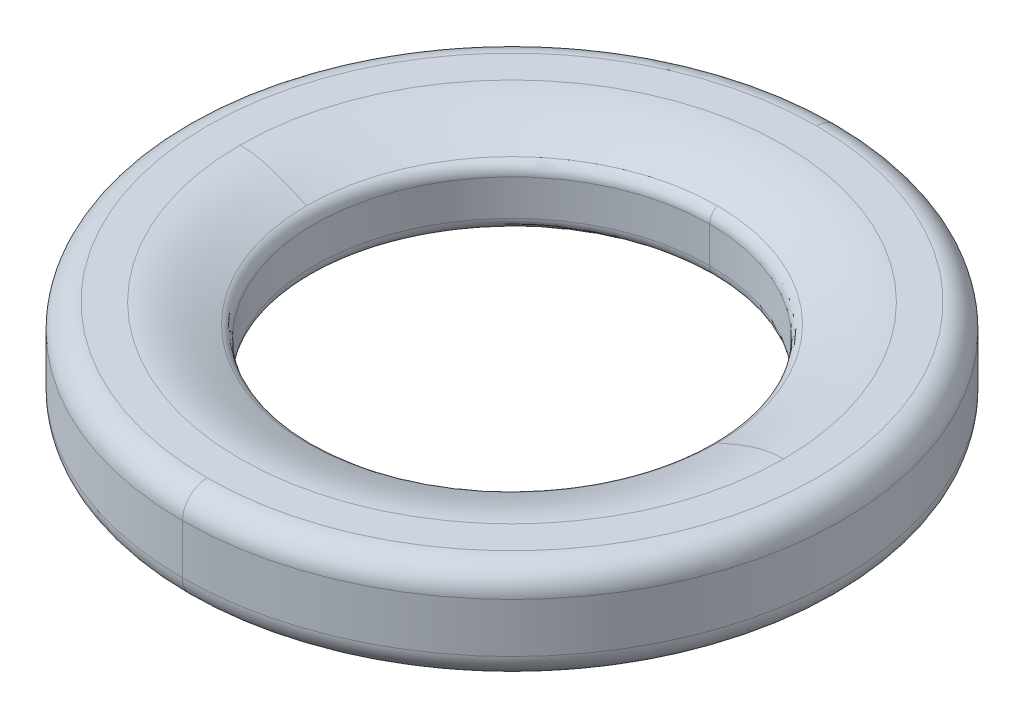
ISO-10303-21;
HEADER;
FILE_DESCRIPTION(('STEP AP214'),'2;1');
FILE_NAME('part.step','',(''),(''),'','','');
FILE_SCHEMA(('AUTOMOTIVE_DESIGN { 1 0 10303 214 1 1 1 1 }'));
ENDSEC;
DATA;
#1=APPLICATION_CONTEXT('core data for automotive mechanical design processes');
#2=APPLICATION_PROTOCOL_DEFINITION('international standard','automotive_design',2000,#1);
#3=PRODUCT_CONTEXT('',#1,'mechanical');
#4=PRODUCT('Part','Part','',(#3));
#5=PRODUCT_RELATED_PRODUCT_CATEGORY('part','',(#4));
#6=PRODUCT_DEFINITION_FORMATION('','',#4);
#7=PRODUCT_DEFINITION_CONTEXT('part definition',#1,'design');
#8=PRODUCT_DEFINITION('design','',#6,#7);
#9=PRODUCT_DEFINITION_SHAPE('','',#8);
#10=(LENGTH_UNIT() NAMED_UNIT(*) SI_UNIT(.MILLI.,.METRE.));
#11=(NAMED_UNIT(*) PLANE_ANGLE_UNIT() SI_UNIT($,.RADIAN.));
#12=(NAMED_UNIT(*) SI_UNIT($,.STERADIAN.) SOLID_ANGLE_UNIT());
#13=UNCERTAINTY_MEASURE_WITH_UNIT(LENGTH_MEASURE(1.E-05),#10,'distance_accuracy_value','');
#14=(GEOMETRIC_REPRESENTATION_CONTEXT(3) GLOBAL_UNCERTAINTY_ASSIGNED_CONTEXT((#13)) GLOBAL_UNIT_ASSIGNED_CONTEXT((#10,
#11,#12)) REPRESENTATION_CONTEXT('',''));
#15=CARTESIAN_POINT('',(0.,0.,0.));
#16=DIRECTION('',(0.,0.,1.));
#17=DIRECTION('',(1.,0.,0.));
#18=AXIS2_PLACEMENT_3D('',#15,#16,#17);
#19=CARTESIAN_POINT('',(-52.3875,9.525,0.));
#20=CARTESIAN_POINT('',(-52.3875,9.52499999999999,104.775));
#21=CARTESIAN_POINT('',(52.3875,9.52499999999999,104.775));
#22=CARTESIAN_POINT('',(52.3875,9.525,0.));
#23=CARTESIAN_POINT('',(-48.128802392508,9.525,0.));
#24=CARTESIAN_POINT('',(-48.128802392508,9.52499999999999,96.2576047850158));
#25=CARTESIAN_POINT('',(48.128802392508,9.52499999999999,96.2576047850158));
#26=CARTESIAN_POINT('',(48.128802392508,9.525,0.));
#27=CARTESIAN_POINT('',(-44.0392353785316,7.77764283602133,0.));
#28=CARTESIAN_POINT('',(-44.0392353785315,7.77764283602133,88.078470757063));
#29=CARTESIAN_POINT('',(44.0392353785315,7.77764283602133,88.078470757063));
#30=CARTESIAN_POINT('',(44.0392353785316,7.77764283602133,0.));
#31=CARTESIAN_POINT('',(-39.597960284823,5.77972972030741,0.));
#32=CARTESIAN_POINT('',(-39.597960284823,5.77972972030741,79.195920569646));
#33=CARTESIAN_POINT('',(39.597960284823,5.77972972030741,79.195920569646));
#34=CARTESIAN_POINT('',(39.597960284823,5.77972972030741,0.));
#35=(BOUNDED_SURFACE() B_SPLINE_SURFACE(3,3,((#19,#20,#21,#22),(#23,#24,#25,#26),(#27,#28,#29,
#30),(#31,#32,#33,#34)),.UNSPECIFIED.,.F.,.F.,.F.) B_SPLINE_SURFACE_WITH_KNOTS((4,4),(4,4),(0.,
0.429598966779843),(0.,1.),
.UNSPECIFIED.) GEOMETRIC_REPRESENTATION_ITEM() RATIONAL_B_SPLINE_SURFACE(((1.,0.333333333333334,
0.333333333333334,1.),(1.,0.333333333333334,0.333333333333334,1.),(1.,0.333333333333334,
0.333333333333334,1.),(1.,0.333333333333334,0.333333333333334,1.))) REPRESENTATION_ITEM('') SURFACE());
#36=CARTESIAN_POINT('',(0.,9.525,0.));
#37=DIRECTION('',(0.,1.,0.));
#38=DIRECTION('',(0.,0.,1.));
#39=AXIS2_PLACEMENT_3D('',#36,#37,#38);
#40=CIRCLE('',#39,52.3875);
#41=CARTESIAN_POINT('',(-52.3875,9.525,0.));
#42=VERTEX_POINT('',#41);
#43=CARTESIAN_POINT('',(52.3875,9.525,0.));
#44=VERTEX_POINT('',#43);
#45=EDGE_CURVE('E9',#42,#44,#40,.T.);
#46=CARTESIAN_POINT('',(52.3875,9.525,0.));
#47=CARTESIAN_POINT('',(48.128802392508,9.525,0.));
#48=CARTESIAN_POINT('',(44.0392353785316,7.77764283602133,0.));
#49=CARTESIAN_POINT('',(39.597960284823,5.77972972030741,0.));
#50=(BOUNDED_CURVE() B_SPLINE_CURVE(3,(#46,#47,#48,#49),.UNSPECIFIED.,.F.,
.F.) B_SPLINE_CURVE_WITH_KNOTS((4,4),(0.,0.429598966779843),
.UNSPECIFIED.) CURVE() GEOMETRIC_REPRESENTATION_ITEM() RATIONAL_B_SPLINE_CURVE((1.,1.,1.,1.)) REPRESENTATION_ITEM(''));
#51=CARTESIAN_POINT('',(39.597960284823,5.77972972030741,0.));
#52=VERTEX_POINT('',#51);
#53=EDGE_CURVE('E26',#44,#52,#50,.T.);
#54=CARTESIAN_POINT('',(0.,5.77972972030741,0.));
#55=DIRECTION('',(0.,-1.,0.));
#56=DIRECTION('',(0.,0.,1.));
#57=AXIS2_PLACEMENT_3D('',#54,#55,#56);
#58=CIRCLE('',#57,39.597960284823);
#59=CARTESIAN_POINT('',(0.,5.77972972030741,39.597960284823));
#60=VERTEX_POINT('',#59);
#61=EDGE_CURVE('E258',#52,#60,#58,.T.);
#62=CARTESIAN_POINT('',(0.,5.77972972030741,0.));
#63=DIRECTION('',(0.,-1.,0.));
#64=DIRECTION('',(0.,0.,1.));
#65=AXIS2_PLACEMENT_3D('',#62,#63,#64);
#66=CIRCLE('',#65,39.597960284823);
#67=CARTESIAN_POINT('',(-39.597960284823,5.77972972030741,0.));
#68=VERTEX_POINT('',#67);
#69=EDGE_CURVE('E164',#60,#68,#66,.T.);
#70=CARTESIAN_POINT('',(-52.3875,9.525,0.));
#71=CARTESIAN_POINT('',(-48.128802392508,9.525,0.));
#72=CARTESIAN_POINT('',(-44.0392353785316,7.77764283602133,0.));
#73=CARTESIAN_POINT('',(-39.597960284823,5.77972972030741,0.));
#74=(BOUNDED_CURVE() B_SPLINE_CURVE(3,(#70,#71,#72,#73),.UNSPECIFIED.,.F.,
.F.) B_SPLINE_CURVE_WITH_KNOTS((4,4),(0.,0.429598966779843),
.UNSPECIFIED.) CURVE() GEOMETRIC_REPRESENTATION_ITEM() RATIONAL_B_SPLINE_CURVE((1.,1.,1.,1.)) REPRESENTATION_ITEM(''));
#75=EDGE_CURVE('E257',#42,#68,#74,.T.);
#76=ORIENTED_EDGE('',*,*,#45,.T.);
#77=ORIENTED_EDGE('',*,*,#53,.T.);
#78=ORIENTED_EDGE('',*,*,#61,.T.);
#79=ORIENTED_EDGE('',*,*,#69,.T.);
#80=ORIENTED_EDGE('',*,*,#75,.F.);
#81=EDGE_LOOP('',(#76,#77,#78,#79,#80));
#82=FACE_BOUND('',#81,.T.);
#83=ADVANCED_FACE('F15',(#82),#35,.F.);
#84=CARTESIAN_POINT('',(52.3875,-9.525,0.));
#85=CARTESIAN_POINT('',(52.3875,-9.52499999999999,-104.775));
#86=CARTESIAN_POINT('',(-52.3875,-9.52499999999999,-104.775));
#87=CARTESIAN_POINT('',(-52.3875,-9.525,0.));
#88=CARTESIAN_POINT('',(48.128802392508,-9.525,0.));
#89=CARTESIAN_POINT('',(48.128802392508,-9.52499999999999,-96.2576047850158));
#90=CARTESIAN_POINT('',(-48.128802392508,-9.52499999999999,-96.2576047850158));
#91=CARTESIAN_POINT('',(-48.128802392508,-9.525,0.));
#92=CARTESIAN_POINT('',(44.0392353785316,-7.77764283602132,0.));
#93=CARTESIAN_POINT('',(44.0392353785316,-7.77764283602131,-88.078470757063));
#94=CARTESIAN_POINT('',(-44.0392353785315,-7.77764283602131,-88.078470757063));
#95=CARTESIAN_POINT('',(-44.0392353785316,-7.77764283602132,0.));
#96=CARTESIAN_POINT('',(39.597960284823,-5.7797297203074,0.));
#97=CARTESIAN_POINT('',(39.597960284823,-5.7797297203074,-79.195920569646));
#98=CARTESIAN_POINT('',(-39.597960284823,-5.7797297203074,-79.195920569646));
#99=CARTESIAN_POINT('',(-39.597960284823,-5.7797297203074,0.));
#100=(BOUNDED_SURFACE() B_SPLINE_SURFACE(3,3,((#84,#85,#86,#87),(#88,#89,#90,#91),(#92,#93,#94,
#95),(#96,#97,#98,#99)),.UNSPECIFIED.,.F.,.F.,.F.) B_SPLINE_SURFACE_WITH_KNOTS((4,4),(4,4),(0.,
0.429598966779843),(0.,1.),
.UNSPECIFIED.) GEOMETRIC_REPRESENTATION_ITEM() RATIONAL_B_SPLINE_SURFACE(((1.,0.333333333333334,
0.333333333333334,1.),(1.,0.333333333333334,0.333333333333334,1.),(1.,0.333333333333334,
0.333333333333334,1.),(1.,0.333333333333334,0.333333333333334,1.))) REPRESENTATION_ITEM('') SURFACE());
#101=CARTESIAN_POINT('',(0.,-9.525,0.));
#102=DIRECTION('',(0.,1.,0.));
#103=DIRECTION('',(0.,0.,1.));
#104=AXIS2_PLACEMENT_3D('',#101,#102,#103);
#105=CIRCLE('',#104,52.3875);
#106=CARTESIAN_POINT('',(52.3875,-9.525,0.));
#107=VERTEX_POINT('',#106);
#108=CARTESIAN_POINT('',(-52.3875,-9.525,0.));
#109=VERTEX_POINT('',#108);
#110=EDGE_CURVE('E159',#107,#109,#105,.T.);
#111=CARTESIAN_POINT('',(52.3875,-9.525,0.));
#112=CARTESIAN_POINT('',(48.128802392508,-9.525,0.));
#113=CARTESIAN_POINT('',(44.0392353785316,-7.77764283602132,0.));
#114=CARTESIAN_POINT('',(39.597960284823,-5.7797297203074,0.));
#115=(BOUNDED_CURVE() B_SPLINE_CURVE(3,(#111,#112,#113,#114),.UNSPECIFIED.,.F.,
.F.) B_SPLINE_CURVE_WITH_KNOTS((4,4),(0.,0.429598966779843),
.UNSPECIFIED.) CURVE() GEOMETRIC_REPRESENTATION_ITEM() RATIONAL_B_SPLINE_CURVE((1.,1.,1.,1.)) REPRESENTATION_ITEM(''));
#116=CARTESIAN_POINT('',(39.597960284823,-5.7797297203074,0.));
#117=VERTEX_POINT('',#116);
#118=EDGE_CURVE('E153',#107,#117,#115,.T.);
#119=CARTESIAN_POINT('',(0.,-5.7797297203074,0.));
#120=DIRECTION('',(0.,1.,0.));
#121=DIRECTION('',(0.,0.,1.));
#122=AXIS2_PLACEMENT_3D('',#119,#120,#121);
#123=CIRCLE('',#122,39.597960284823);
#124=CARTESIAN_POINT('',(0.,-5.7797297203074,-39.597960284823));
#125=VERTEX_POINT('',#124);
#126=EDGE_CURVE('E143',#117,#125,#123,.T.);
#127=CARTESIAN_POINT('',(0.,-5.7797297203074,0.));
#128=DIRECTION('',(0.,1.,0.));
#129=DIRECTION('',(0.,0.,1.));
#130=AXIS2_PLACEMENT_3D('',#127,#128,#129);
#131=CIRCLE('',#130,39.597960284823);
#132=CARTESIAN_POINT('',(-39.597960284823,-5.7797297203074,0.));
#133=VERTEX_POINT('',#132);
#134=EDGE_CURVE('E154',#125,#133,#131,.T.);
#135=CARTESIAN_POINT('',(-52.3875,-9.525,0.));
#136=CARTESIAN_POINT('',(-48.128802392508,-9.525,0.));
#137=CARTESIAN_POINT('',(-44.0392353785316,-7.77764283602132,0.));
#138=CARTESIAN_POINT('',(-39.597960284823,-5.7797297203074,0.));
#139=(BOUNDED_CURVE() B_SPLINE_CURVE(3,(#135,#136,#137,#138),.UNSPECIFIED.,.F.,
.F.) B_SPLINE_CURVE_WITH_KNOTS((4,4),(0.,0.429598966779843),
.UNSPECIFIED.) CURVE() GEOMETRIC_REPRESENTATION_ITEM() RATIONAL_B_SPLINE_CURVE((1.,1.,1.,1.)) REPRESENTATION_ITEM(''));
#140=EDGE_CURVE('E178',#109,#133,#139,.T.);
#141=ORIENTED_EDGE('',*,*,#110,.F.);
#142=ORIENTED_EDGE('',*,*,#118,.T.);
#143=ORIENTED_EDGE('',*,*,#126,.T.);
#144=ORIENTED_EDGE('',*,*,#134,.T.);
#145=ORIENTED_EDGE('',*,*,#140,.F.);
#146=EDGE_LOOP('',(#141,#142,#143,#144,#145));
#147=FACE_BOUND('',#146,.T.);
#148=ADVANCED_FACE('F157',(#147),#100,.T.);
#149=CARTESIAN_POINT('',(0.,3.46332016412055,0.));
#150=DIRECTION('',(0.,-1.,0.));
#151=DIRECTION('',(0.,0.,-1.));
#152=AXIS2_PLACEMENT_3D('',#149,#150,#151);
#153=TOROIDAL_SURFACE('',#152,40.64,2.54);
#154=CARTESIAN_POINT('',(0.,3.46332016412055,0.));
#155=DIRECTION('',(0.,1.,0.));
#156=DIRECTION('',(0.,0.,-1.));
#157=AXIS2_PLACEMENT_3D('',#154,#155,#156);
#158=CIRCLE('',#157,38.1);
#159=CARTESIAN_POINT('',(0.,3.46332016412055,38.1));
#160=VERTEX_POINT('',#159);
#161=CARTESIAN_POINT('',(0.,3.46332016412055,-38.1));
#162=VERTEX_POINT('',#161);
#163=EDGE_CURVE('E244',#160,#162,#158,.T.);
#164=ORIENTED_EDGE('',*,*,#163,.F.);
#165=CARTESIAN_POINT('',(0.,3.46332016412055,40.64));
#166=DIRECTION('',(1.,0.,0.));
#167=DIRECTION('',(0.,0.,-1.));
#168=AXIS2_PLACEMENT_3D('',#165,#166,#167);
#169=CIRCLE('',#168,2.54);
#170=EDGE_CURVE('E241',#160,#60,#169,.T.);
#171=ORIENTED_EDGE('',*,*,#170,.T.);
#172=ORIENTED_EDGE('',*,*,#61,.F.);
#173=CARTESIAN_POINT('',(0.,5.77972972030741,0.));
#174=DIRECTION('',(0.,-1.,0.));
#175=DIRECTION('',(0.,0.,1.));
#176=AXIS2_PLACEMENT_3D('',#173,#174,#175);
#177=CIRCLE('',#176,39.597960284823);
#178=CARTESIAN_POINT('',(0.,5.77972972030741,-39.597960284823));
#179=VERTEX_POINT('',#178);
#180=EDGE_CURVE('E251',#179,#52,#177,.T.);
#181=ORIENTED_EDGE('',*,*,#180,.F.);
#182=CARTESIAN_POINT('',(0.,3.46332016412055,-40.64));
#183=DIRECTION('',(-1.,0.,0.));
#184=DIRECTION('',(0.,0.,1.));
#185=AXIS2_PLACEMENT_3D('',#182,#183,#184);
#186=CIRCLE('',#185,2.54);
#187=EDGE_CURVE('E212',#162,#179,#186,.T.);
#188=ORIENTED_EDGE('',*,*,#187,.F.);
#189=EDGE_LOOP('',(#164,#171,#172,#181,#188));
#190=FACE_BOUND('',#189,.T.);
#191=ADVANCED_FACE('F359',(#190),#153,.T.);
#192=CARTESIAN_POINT('',(0.,-3.46332016412053,0.));
#193=DIRECTION('',(0.,-1.,0.));
#194=DIRECTION('',(0.,0.,-1.));
#195=AXIS2_PLACEMENT_3D('',#192,#193,#194);
#196=TOROIDAL_SURFACE('',#195,40.64,2.54);
#197=CARTESIAN_POINT('',(0.,-5.7797297203074,0.));
#198=DIRECTION('',(0.,1.,0.));
#199=DIRECTION('',(0.,0.,1.));
#200=AXIS2_PLACEMENT_3D('',#197,#198,#199);
#201=CIRCLE('',#200,39.597960284823);
#202=CARTESIAN_POINT('',(0.,-5.7797297203074,39.597960284823));
#203=VERTEX_POINT('',#202);
#204=EDGE_CURVE('E148',#203,#117,#201,.T.);
#205=ORIENTED_EDGE('',*,*,#204,.F.);
#206=CARTESIAN_POINT('',(0.,-3.46332016412053,40.64));
#207=DIRECTION('',(1.,0.,0.));
#208=DIRECTION('',(0.,0.,-1.));
#209=AXIS2_PLACEMENT_3D('',#206,#207,#208);
#210=CIRCLE('',#209,2.54);
#211=CARTESIAN_POINT('',(0.,-3.46332016412053,38.1));
#212=VERTEX_POINT('',#211);
#213=EDGE_CURVE('E223',#203,#212,#210,.T.);
#214=ORIENTED_EDGE('',*,*,#213,.T.);
#215=CARTESIAN_POINT('',(0.,-3.46332016412053,0.));
#216=DIRECTION('',(0.,-1.,0.));
#217=DIRECTION('',(0.,0.,-1.));
#218=AXIS2_PLACEMENT_3D('',#215,#216,#217);
#219=CIRCLE('',#218,38.1);
#220=CARTESIAN_POINT('',(0.,-3.46332016412053,-38.1));
#221=VERTEX_POINT('',#220);
#222=EDGE_CURVE('E114',#221,#212,#219,.T.);
#223=ORIENTED_EDGE('',*,*,#222,.F.);
#224=CARTESIAN_POINT('',(0.,-3.46332016412053,-40.64));
#225=DIRECTION('',(-1.,0.,0.));
#226=DIRECTION('',(0.,0.,1.));
#227=AXIS2_PLACEMENT_3D('',#224,#225,#226);
#228=CIRCLE('',#227,2.54);
#229=EDGE_CURVE('E127',#125,#221,#228,.T.);
#230=ORIENTED_EDGE('',*,*,#229,.F.);
#231=ORIENTED_EDGE('',*,*,#126,.F.);
#232=EDGE_LOOP('',(#205,#214,#223,#230,#231));
#233=FACE_BOUND('',#232,.T.);
#234=ADVANCED_FACE('F145',(#233),#196,.T.);
#235=CARTESIAN_POINT('',(0.,-4.7625,0.));
#236=DIRECTION('',(0.,1.,0.));
#237=DIRECTION('',(0.,0.,1.));
#238=AXIS2_PLACEMENT_3D('',#235,#236,#237);
#239=TOROIDAL_SURFACE('',#238,58.7375,4.7625);
#240=CARTESIAN_POINT('',(0.,-9.525,0.));
#241=DIRECTION('',(0.,1.,0.));
#242=DIRECTION('',(0.,0.,1.));
#243=AXIS2_PLACEMENT_3D('',#240,#241,#242);
#244=CIRCLE('',#243,58.7375);
#245=CARTESIAN_POINT('',(0.,-9.525,58.7375));
#246=VERTEX_POINT('',#245);
#247=CARTESIAN_POINT('',(0.,-9.525,-58.7375));
#248=VERTEX_POINT('',#247);
#249=EDGE_CURVE('E219',#246,#248,#244,.T.);
#250=ORIENTED_EDGE('',*,*,#249,.T.);
#251=CARTESIAN_POINT('',(0.,-4.7625,-58.7375));
#252=DIRECTION('',(1.,0.,0.));
#253=DIRECTION('',(0.,0.,-1.));
#254=AXIS2_PLACEMENT_3D('',#251,#252,#253);
#255=CIRCLE('',#254,4.7625);
#256=CARTESIAN_POINT('',(0.,-4.7625,-63.5));
#257=VERTEX_POINT('',#256);
#258=EDGE_CURVE('E224',#248,#257,#255,.T.);
#259=ORIENTED_EDGE('',*,*,#258,.T.);
#260=CARTESIAN_POINT('',(0.,-4.7625,0.));
#261=DIRECTION('',(0.,1.,0.));
#262=DIRECTION('',(0.,0.,1.));
#263=AXIS2_PLACEMENT_3D('',#260,#261,#262);
#264=CIRCLE('',#263,63.5);
#265=CARTESIAN_POINT('',(0.,-4.7625,63.5));
#266=VERTEX_POINT('',#265);
#267=EDGE_CURVE('E297',#266,#257,#264,.T.);
#268=ORIENTED_EDGE('',*,*,#267,.F.);
#269=CARTESIAN_POINT('',(0.,-4.7625,58.7375));
#270=DIRECTION('',(-1.,0.,0.));
#271=DIRECTION('',(0.,0.,1.));
#272=AXIS2_PLACEMENT_3D('',#269,#270,#271);
#273=CIRCLE('',#272,4.7625);
#274=EDGE_CURVE('E198',#246,#266,#273,.T.);
#275=ORIENTED_EDGE('',*,*,#274,.F.);
#276=EDGE_LOOP('',(#250,#259,#268,#275));
#277=FACE_BOUND('',#276,.T.);
#278=ADVANCED_FACE('F321',(#277),#239,.T.);
#279=CARTESIAN_POINT('',(0.,9.525,0.));
#280=DIRECTION('',(0.,1.,0.));
#281=DIRECTION('',(0.,0.,1.));
#282=AXIS2_PLACEMENT_3D('',#279,#280,#281);
#283=CYLINDRICAL_SURFACE('',#282,63.5);
#284=ORIENTED_EDGE('',*,*,#267,.T.);
#285=DIRECTION('',(0.,1.,0.));
#286=VECTOR('',#285,1.);
#287=CARTESIAN_POINT('',(0.,9.525,-63.5));
#288=LINE('',#287,#286);
#289=CARTESIAN_POINT('',(0.,4.7625,-63.5));
#290=VERTEX_POINT('',#289);
#291=EDGE_CURVE('E217',#257,#290,#288,.T.);
#292=ORIENTED_EDGE('',*,*,#291,.T.);
#293=CARTESIAN_POINT('',(0.,4.7625,0.));
#294=DIRECTION('',(0.,1.,0.));
#295=DIRECTION('',(0.,0.,1.));
#296=AXIS2_PLACEMENT_3D('',#293,#294,#295);
#297=CIRCLE('',#296,63.5);
#298=CARTESIAN_POINT('',(0.,4.7625,63.5));
#299=VERTEX_POINT('',#298);
#300=EDGE_CURVE('E213',#299,#290,#297,.T.);
#301=ORIENTED_EDGE('',*,*,#300,.F.);
#302=DIRECTION('',(0.,1.,0.));
#303=VECTOR('',#302,1.);
#304=CARTESIAN_POINT('',(0.,9.525,63.5));
#305=LINE('',#304,#303);
#306=EDGE_CURVE('E209',#266,#299,#305,.T.);
#307=ORIENTED_EDGE('',*,*,#306,.F.);
#308=EDGE_LOOP('',(#284,#292,#301,#307));
#309=FACE_BOUND('',#308,.T.);
#310=ADVANCED_FACE('F333',(#309),#283,.T.);
#311=CARTESIAN_POINT('',(0.,4.7625,0.));
#312=DIRECTION('',(0.,1.,0.));
#313=DIRECTION('',(0.,0.,1.));
#314=AXIS2_PLACEMENT_3D('',#311,#312,#313);
#315=TOROIDAL_SURFACE('',#314,58.7375,4.7625);
#316=ORIENTED_EDGE('',*,*,#300,.T.);
#317=CARTESIAN_POINT('',(0.,4.7625,-58.7375));
#318=DIRECTION('',(1.,0.,0.));
#319=DIRECTION('',(0.,0.,-1.));
#320=AXIS2_PLACEMENT_3D('',#317,#318,#319);
#321=CIRCLE('',#320,4.7625);
#322=CARTESIAN_POINT('',(0.,9.525,-58.7375));
#323=VERTEX_POINT('',#322);
#324=EDGE_CURVE('E218',#290,#323,#321,.T.);
#325=ORIENTED_EDGE('',*,*,#324,.T.);
#326=CARTESIAN_POINT('',(0.,9.525,0.));
#327=DIRECTION('',(0.,1.,0.));
#328=DIRECTION('',(0.,0.,1.));
#329=AXIS2_PLACEMENT_3D('',#326,#327,#328);
#330=CIRCLE('',#329,58.7375);
#331=CARTESIAN_POINT('',(0.,9.525,58.7375));
#332=VERTEX_POINT('',#331);
#333=EDGE_CURVE('E238',#332,#323,#330,.T.);
#334=ORIENTED_EDGE('',*,*,#333,.F.);
#335=CARTESIAN_POINT('',(0.,4.7625,58.7375));
#336=DIRECTION('',(-1.,0.,0.));
#337=DIRECTION('',(0.,0.,1.));
#338=AXIS2_PLACEMENT_3D('',#335,#336,#337);
#339=CIRCLE('',#338,4.7625);
#340=EDGE_CURVE('E193',#299,#332,#339,.T.);
#341=ORIENTED_EDGE('',*,*,#340,.F.);
#342=EDGE_LOOP('',(#316,#325,#334,#341));
#343=FACE_BOUND('',#342,.T.);
#344=ADVANCED_FACE('F339',(#343),#315,.T.);
#345=CARTESIAN_POINT('',(0.,9.525,0.));
#346=DIRECTION('',(0.,1.,0.));
#347=DIRECTION('',(0.,0.,1.));
#348=AXIS2_PLACEMENT_3D('',#345,#346,#347);
#349=CYLINDRICAL_SURFACE('',#348,38.1);
#350=CARTESIAN_POINT('',(0.,-3.46332016412053,0.));
#351=DIRECTION('',(0.,-1.,0.));
#352=DIRECTION('',(0.,0.,-1.));
#353=AXIS2_PLACEMENT_3D('',#350,#351,#352);
#354=CIRCLE('',#353,38.1);
#355=EDGE_CURVE('E19',#212,#221,#354,.T.);
#356=ORIENTED_EDGE('',*,*,#355,.T.);
#357=DIRECTION('',(0.,1.,0.));
#358=VECTOR('',#357,1.);
#359=CARTESIAN_POINT('',(0.,9.525,-38.1));
#360=LINE('',#359,#358);
#361=EDGE_CURVE('E231',#221,#162,#360,.T.);
#362=ORIENTED_EDGE('',*,*,#361,.T.);
#363=CARTESIAN_POINT('',(0.,3.46332016412055,0.));
#364=DIRECTION('',(0.,1.,0.));
#365=DIRECTION('',(0.,0.,-1.));
#366=AXIS2_PLACEMENT_3D('',#363,#364,#365);
#367=CIRCLE('',#366,38.1);
#368=EDGE_CURVE('E187',#162,#160,#367,.T.);
#369=ORIENTED_EDGE('',*,*,#368,.T.);
#370=DIRECTION('',(0.,1.,0.));
#371=VECTOR('',#370,1.);
#372=CARTESIAN_POINT('',(0.,9.525,38.1));
#373=LINE('',#372,#371);
#374=EDGE_CURVE('E180',#212,#160,#373,.T.);
#375=ORIENTED_EDGE('',*,*,#374,.F.);
#376=EDGE_LOOP('',(#356,#362,#369,#375));
#377=FACE_BOUND('',#376,.T.);
#378=ADVANCED_FACE('F362',(#377),#349,.F.);
#379=CARTESIAN_POINT('',(0.,-9.525,0.));
#380=DIRECTION('',(0.,1.,0.));
#381=DIRECTION('',(1.,0.,0.));
#382=AXIS2_PLACEMENT_3D('',#379,#380,#381);
#383=PLANE('',#382);
#384=ORIENTED_EDGE('',*,*,#249,.F.);
#385=CARTESIAN_POINT('',(0.,-9.525,0.));
#386=DIRECTION('',(0.,1.,0.));
#387=DIRECTION('',(0.,0.,1.));
#388=AXIS2_PLACEMENT_3D('',#385,#386,#387);
#389=CIRCLE('',#388,58.7375);
#390=EDGE_CURVE('E204',#248,#246,#389,.T.);
#391=ORIENTED_EDGE('',*,*,#390,.F.);
#392=EDGE_LOOP('',(#384,#391));
#393=FACE_BOUND('',#392,.T.);
#394=CARTESIAN_POINT('',(0.,-9.525,0.));
#395=DIRECTION('',(0.,1.,0.));
#396=DIRECTION('',(0.,0.,1.));
#397=AXIS2_PLACEMENT_3D('',#394,#395,#396);
#398=CIRCLE('',#397,52.3875);
#399=EDGE_CURVE('E184',#109,#107,#398,.T.);
#400=ORIENTED_EDGE('',*,*,#399,.T.);
#401=ORIENTED_EDGE('',*,*,#110,.T.);
#402=EDGE_LOOP('',(#400,#401));
#403=FACE_BOUND('',#402,.T.);
#404=ADVANCED_FACE('F273',(#393,#403),#383,.F.);
#405=CARTESIAN_POINT('',(-52.3875,-9.525,0.));
#406=CARTESIAN_POINT('',(-52.3875,-9.52499999999999,104.775));
#407=CARTESIAN_POINT('',(52.3875,-9.52499999999999,104.775));
#408=CARTESIAN_POINT('',(52.3875,-9.525,0.));
#409=CARTESIAN_POINT('',(-48.128802392508,-9.525,0.));
#410=CARTESIAN_POINT('',(-48.128802392508,-9.52499999999999,96.2576047850158));
#411=CARTESIAN_POINT('',(48.128802392508,-9.52499999999999,96.2576047850158));
#412=CARTESIAN_POINT('',(48.128802392508,-9.525,0.));
#413=CARTESIAN_POINT('',(-44.0392353785316,-7.77764283602132,0.));
#414=CARTESIAN_POINT('',(-44.0392353785315,-7.77764283602131,88.078470757063));
#415=CARTESIAN_POINT('',(44.0392353785315,-7.77764283602131,88.078470757063));
#416=CARTESIAN_POINT('',(44.0392353785316,-7.77764283602132,0.));
#417=CARTESIAN_POINT('',(-39.597960284823,-5.7797297203074,0.));
#418=CARTESIAN_POINT('',(-39.597960284823,-5.7797297203074,79.195920569646));
#419=CARTESIAN_POINT('',(39.597960284823,-5.7797297203074,79.195920569646));
#420=CARTESIAN_POINT('',(39.597960284823,-5.7797297203074,0.));
#421=(BOUNDED_SURFACE() B_SPLINE_SURFACE(3,3,((#405,#406,#407,#408),(#409,#410,#411,#412),(#413,
#414,#415,#416),(#417,#418,#419,#420)),.UNSPECIFIED.,.F.,.F.,
.F.) B_SPLINE_SURFACE_WITH_KNOTS((4,4),(4,4),(0.,0.429598966779843),(0.,1.),
.UNSPECIFIED.) GEOMETRIC_REPRESENTATION_ITEM() RATIONAL_B_SPLINE_SURFACE(((1.,0.333333333333334,
0.333333333333334,1.),(1.,0.333333333333334,0.333333333333334,1.),(1.,0.333333333333334,
0.333333333333334,1.),(1.,0.333333333333334,0.333333333333334,1.))) REPRESENTATION_ITEM('') SURFACE());
#422=CARTESIAN_POINT('',(0.,-5.7797297203074,0.));
#423=DIRECTION('',(0.,1.,0.));
#424=DIRECTION('',(0.,0.,1.));
#425=AXIS2_PLACEMENT_3D('',#422,#423,#424);
#426=CIRCLE('',#425,39.597960284823);
#427=EDGE_CURVE('E170',#133,#203,#426,.T.);
#428=ORIENTED_EDGE('',*,*,#118,.F.);
#429=ORIENTED_EDGE('',*,*,#399,.F.);
#430=ORIENTED_EDGE('',*,*,#140,.T.);
#431=ORIENTED_EDGE('',*,*,#427,.T.);
#432=ORIENTED_EDGE('',*,*,#204,.T.);
#433=EDGE_LOOP('',(#428,#429,#430,#431,#432));
#434=FACE_BOUND('',#433,.T.);
#435=ADVANCED_FACE('F167',(#434),#421,.T.);
#436=CARTESIAN_POINT('',(0.,9.525,0.));
#437=DIRECTION('',(0.,1.,0.));
#438=DIRECTION('',(0.,0.,1.));
#439=AXIS2_PLACEMENT_3D('',#436,#437,#438);
#440=CYLINDRICAL_SURFACE('',#439,38.1);
#441=ORIENTED_EDGE('',*,*,#361,.F.);
#442=ORIENTED_EDGE('',*,*,#222,.T.);
#443=ORIENTED_EDGE('',*,*,#374,.T.);
#444=ORIENTED_EDGE('',*,*,#163,.T.);
#445=EDGE_LOOP('',(#441,#442,#443,#444));
#446=FACE_BOUND('',#445,.T.);
#447=ADVANCED_FACE('F360',(#446),#440,.F.);
#448=CARTESIAN_POINT('',(52.3875,9.525,0.));
#449=CARTESIAN_POINT('',(52.3875,9.52499999999999,-104.775));
#450=CARTESIAN_POINT('',(-52.3875,9.52499999999999,-104.775));
#451=CARTESIAN_POINT('',(-52.3875,9.525,0.));
#452=CARTESIAN_POINT('',(48.128802392508,9.525,0.));
#453=CARTESIAN_POINT('',(48.128802392508,9.52499999999999,-96.2576047850158));
#454=CARTESIAN_POINT('',(-48.128802392508,9.52499999999999,-96.2576047850158));
#455=CARTESIAN_POINT('',(-48.128802392508,9.525,0.));
#456=CARTESIAN_POINT('',(44.0392353785316,7.77764283602133,0.));
#457=CARTESIAN_POINT('',(44.0392353785316,7.77764283602133,-88.078470757063));
#458=CARTESIAN_POINT('',(-44.0392353785315,7.77764283602133,-88.078470757063));
#459=CARTESIAN_POINT('',(-44.0392353785316,7.77764283602133,0.));
#460=CARTESIAN_POINT('',(39.597960284823,5.77972972030741,0.));
#461=CARTESIAN_POINT('',(39.597960284823,5.77972972030741,-79.195920569646));
#462=CARTESIAN_POINT('',(-39.597960284823,5.77972972030741,-79.195920569646));
#463=CARTESIAN_POINT('',(-39.597960284823,5.77972972030741,0.));
#464=(BOUNDED_SURFACE() B_SPLINE_SURFACE(3,3,((#448,#449,#450,#451),(#452,#453,#454,#455),(#456,
#457,#458,#459),(#460,#461,#462,#463)),.UNSPECIFIED.,.F.,.F.,
.F.) B_SPLINE_SURFACE_WITH_KNOTS((4,4),(4,4),(0.,0.429598966779843),(0.,1.),
.UNSPECIFIED.) GEOMETRIC_REPRESENTATION_ITEM() RATIONAL_B_SPLINE_SURFACE(((1.,0.333333333333334,
0.333333333333334,1.),(1.,0.333333333333334,0.333333333333334,1.),(1.,0.333333333333334,
0.333333333333334,1.),(1.,0.333333333333334,0.333333333333334,1.))) REPRESENTATION_ITEM('') SURFACE());
#465=CARTESIAN_POINT('',(0.,9.525,0.));
#466=DIRECTION('',(0.,1.,0.));
#467=DIRECTION('',(0.,0.,1.));
#468=AXIS2_PLACEMENT_3D('',#465,#466,#467);
#469=CIRCLE('',#468,52.3875);
#470=EDGE_CURVE('E248',#44,#42,#469,.T.);
#471=CARTESIAN_POINT('',(0.,5.77972972030741,0.));
#472=DIRECTION('',(0.,-1.,0.));
#473=DIRECTION('',(0.,0.,1.));
#474=AXIS2_PLACEMENT_3D('',#471,#472,#473);
#475=CIRCLE('',#474,39.597960284823);
#476=EDGE_CURVE('E265',#68,#179,#475,.T.);
#477=ORIENTED_EDGE('',*,*,#53,.F.);
#478=ORIENTED_EDGE('',*,*,#470,.T.);
#479=ORIENTED_EDGE('',*,*,#75,.T.);
#480=ORIENTED_EDGE('',*,*,#476,.T.);
#481=ORIENTED_EDGE('',*,*,#180,.T.);
#482=EDGE_LOOP('',(#477,#478,#479,#480,#481));
#483=FACE_BOUND('',#482,.T.);
#484=ADVANCED_FACE('F344',(#483),#464,.F.);
#485=CARTESIAN_POINT('',(0.,9.525,0.));
#486=DIRECTION('',(0.,-1.,0.));
#487=DIRECTION('',(0.,0.,-1.));
#488=AXIS2_PLACEMENT_3D('',#485,#486,#487);
#489=PLANE('',#488);
#490=ORIENTED_EDGE('',*,*,#333,.T.);
#491=CARTESIAN_POINT('',(0.,9.525,0.));
#492=DIRECTION('',(0.,1.,0.));
#493=DIRECTION('',(0.,0.,1.));
#494=AXIS2_PLACEMENT_3D('',#491,#492,#493);
#495=CIRCLE('',#494,58.7375);
#496=EDGE_CURVE('E192',#323,#332,#495,.T.);
#497=ORIENTED_EDGE('',*,*,#496,.T.);
#498=EDGE_LOOP('',(#490,#497));
#499=FACE_BOUND('',#498,.T.);
#500=ORIENTED_EDGE('',*,*,#45,.F.);
#501=ORIENTED_EDGE('',*,*,#470,.F.);
#502=EDGE_LOOP('',(#500,#501));
#503=FACE_BOUND('',#502,.T.);
#504=ADVANCED_FACE('F341',(#499,#503),#489,.F.);
#505=CARTESIAN_POINT('',(0.,4.7625,0.));
#506=DIRECTION('',(0.,1.,0.));
#507=DIRECTION('',(0.,0.,1.));
#508=AXIS2_PLACEMENT_3D('',#505,#506,#507);
#509=TOROIDAL_SURFACE('',#508,58.7375,4.7625);
#510=ORIENTED_EDGE('',*,*,#324,.F.);
#511=CARTESIAN_POINT('',(0.,4.7625,0.));
#512=DIRECTION('',(0.,1.,0.));
#513=DIRECTION('',(0.,0.,1.));
#514=AXIS2_PLACEMENT_3D('',#511,#512,#513);
#515=CIRCLE('',#514,63.5);
#516=EDGE_CURVE('E188',#290,#299,#515,.T.);
#517=ORIENTED_EDGE('',*,*,#516,.T.);
#518=ORIENTED_EDGE('',*,*,#340,.T.);
#519=ORIENTED_EDGE('',*,*,#496,.F.);
#520=EDGE_LOOP('',(#510,#517,#518,#519));
#521=FACE_BOUND('',#520,.T.);
#522=ADVANCED_FACE('F336',(#521),#509,.T.);
#523=CARTESIAN_POINT('',(0.,9.525,0.));
#524=DIRECTION('',(0.,1.,0.));
#525=DIRECTION('',(0.,0.,1.));
#526=AXIS2_PLACEMENT_3D('',#523,#524,#525);
#527=CYLINDRICAL_SURFACE('',#526,63.5);
#528=ORIENTED_EDGE('',*,*,#291,.F.);
#529=CARTESIAN_POINT('',(0.,-4.7625,0.));
#530=DIRECTION('',(0.,1.,0.));
#531=DIRECTION('',(0.,0.,1.));
#532=AXIS2_PLACEMENT_3D('',#529,#530,#531);
#533=CIRCLE('',#532,63.5);
#534=EDGE_CURVE('E205',#257,#266,#533,.T.);
#535=ORIENTED_EDGE('',*,*,#534,.T.);
#536=ORIENTED_EDGE('',*,*,#306,.T.);
#537=ORIENTED_EDGE('',*,*,#516,.F.);
#538=EDGE_LOOP('',(#528,#535,#536,#537));
#539=FACE_BOUND('',#538,.T.);
#540=ADVANCED_FACE('F328',(#539),#527,.T.);
#541=CARTESIAN_POINT('',(0.,-4.7625,0.));
#542=DIRECTION('',(0.,1.,0.));
#543=DIRECTION('',(0.,0.,1.));
#544=AXIS2_PLACEMENT_3D('',#541,#542,#543);
#545=TOROIDAL_SURFACE('',#544,58.7375,4.7625);
#546=ORIENTED_EDGE('',*,*,#258,.F.);
#547=ORIENTED_EDGE('',*,*,#390,.T.);
#548=ORIENTED_EDGE('',*,*,#274,.T.);
#549=ORIENTED_EDGE('',*,*,#534,.F.);
#550=EDGE_LOOP('',(#546,#547,#548,#549));
#551=FACE_BOUND('',#550,.T.);
#552=ADVANCED_FACE('F325',(#551),#545,.T.);
#553=CARTESIAN_POINT('',(0.,-3.46332016412053,0.));
#554=DIRECTION('',(0.,-1.,0.));
#555=DIRECTION('',(0.,0.,-1.));
#556=AXIS2_PLACEMENT_3D('',#553,#554,#555);
#557=TOROIDAL_SURFACE('',#556,40.64,2.54);
#558=ORIENTED_EDGE('',*,*,#213,.F.);
#559=ORIENTED_EDGE('',*,*,#427,.F.);
#560=ORIENTED_EDGE('',*,*,#134,.F.);
#561=ORIENTED_EDGE('',*,*,#229,.T.);
#562=ORIENTED_EDGE('',*,*,#355,.F.);
#563=EDGE_LOOP('',(#558,#559,#560,#561,#562));
#564=FACE_BOUND('',#563,.T.);
#565=ADVANCED_FACE('F17',(#564),#557,.T.);
#566=CARTESIAN_POINT('',(0.,3.46332016412055,0.));
#567=DIRECTION('',(0.,-1.,0.));
#568=DIRECTION('',(0.,0.,-1.));
#569=AXIS2_PLACEMENT_3D('',#566,#567,#568);
#570=TOROIDAL_SURFACE('',#569,40.64,2.54);
#571=ORIENTED_EDGE('',*,*,#170,.F.);
#572=ORIENTED_EDGE('',*,*,#368,.F.);
#573=ORIENTED_EDGE('',*,*,#187,.T.);
#574=ORIENTED_EDGE('',*,*,#476,.F.);
#575=ORIENTED_EDGE('',*,*,#69,.F.);
#576=EDGE_LOOP('',(#571,#572,#573,#574,#575));
#577=FACE_BOUND('',#576,.T.);
#578=ADVANCED_FACE('F355',(#577),#570,.T.);
#579=CLOSED_SHELL('',(#83,#148,#191,#234,#278,#310,#344,#378,#404,#435,#447,#484,#504,#522,#540,
#552,#565,#578));
#580=MANIFOLD_SOLID_BREP('B1',#579);
#581=ADVANCED_BREP_SHAPE_REPRESENTATION('',(#18,#580),#14);
#582=SHAPE_DEFINITION_REPRESENTATION(#9,#581);
ENDSEC;
END-ISO-10303-21;
